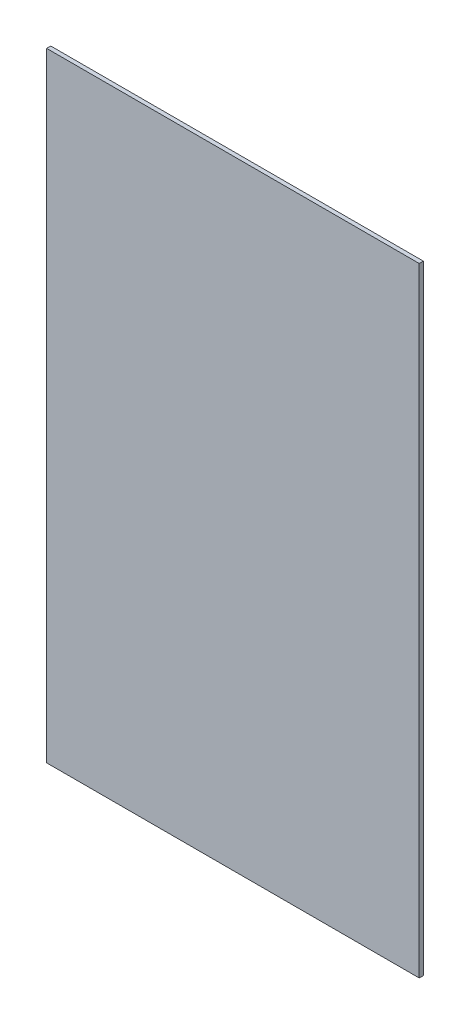
ISO-10303-21;
HEADER;
FILE_DESCRIPTION(('STEP AP214'),'2;1');
FILE_NAME('part.step','',(''),(''),'','','');
FILE_SCHEMA(('AUTOMOTIVE_DESIGN { 1 0 10303 214 1 1 1 1 }'));
ENDSEC;
DATA;
#1=APPLICATION_CONTEXT('core data for automotive mechanical design processes');
#2=APPLICATION_PROTOCOL_DEFINITION('international standard','automotive_design',2000,#1);
#3=PRODUCT_CONTEXT('',#1,'mechanical');
#4=PRODUCT('Part','Part','',(#3));
#5=PRODUCT_RELATED_PRODUCT_CATEGORY('part','',(#4));
#6=PRODUCT_DEFINITION_FORMATION('','',#4);
#7=PRODUCT_DEFINITION_CONTEXT('part definition',#1,'design');
#8=PRODUCT_DEFINITION('design','',#6,#7);
#9=PRODUCT_DEFINITION_SHAPE('','',#8);
#10=(LENGTH_UNIT() NAMED_UNIT(*) SI_UNIT(.MILLI.,.METRE.));
#11=(NAMED_UNIT(*) PLANE_ANGLE_UNIT() SI_UNIT($,.RADIAN.));
#12=(NAMED_UNIT(*) SI_UNIT($,.STERADIAN.) SOLID_ANGLE_UNIT());
#13=UNCERTAINTY_MEASURE_WITH_UNIT(LENGTH_MEASURE(1.E-05),#10,'distance_accuracy_value','');
#14=(GEOMETRIC_REPRESENTATION_CONTEXT(3) GLOBAL_UNCERTAINTY_ASSIGNED_CONTEXT((#13)) GLOBAL_UNIT_ASSIGNED_CONTEXT((#10,
#11,#12)) REPRESENTATION_CONTEXT('',''));
#15=CARTESIAN_POINT('',(0.,0.,0.));
#16=DIRECTION('',(0.,0.,1.));
#17=DIRECTION('',(1.,0.,0.));
#18=AXIS2_PLACEMENT_3D('',#15,#16,#17);
#19=CARTESIAN_POINT('',(227.,-377.,5.));
#20=DIRECTION('',(-1.,0.,0.));
#21=DIRECTION('',(0.,0.,1.));
#22=AXIS2_PLACEMENT_3D('',#19,#20,#21);
#23=PLANE('',#22);
#24=DIRECTION('',(0.,1.,0.));
#25=VECTOR('',#24,1.);
#26=CARTESIAN_POINT('',(227.,-377.,0.));
#27=LINE('',#26,#25);
#28=CARTESIAN_POINT('',(227.,-377.,0.));
#29=VERTEX_POINT('',#28);
#30=CARTESIAN_POINT('',(227.,377.,0.));
#31=VERTEX_POINT('',#30);
#32=EDGE_CURVE('E107',#29,#31,#27,.T.);
#33=ORIENTED_EDGE('',*,*,#32,.T.);
#34=DIRECTION('',(0.,0.,-1.));
#35=VECTOR('',#34,1.);
#36=CARTESIAN_POINT('',(227.,377.,5.));
#37=LINE('',#36,#35);
#38=CARTESIAN_POINT('',(227.,377.,5.));
#39=VERTEX_POINT('',#38);
#40=EDGE_CURVE('E11',#39,#31,#37,.T.);
#41=ORIENTED_EDGE('',*,*,#40,.F.);
#42=DIRECTION('',(0.,1.,0.));
#43=VECTOR('',#42,1.);
#44=CARTESIAN_POINT('',(227.,-377.,5.));
#45=LINE('',#44,#43);
#46=CARTESIAN_POINT('',(227.,-377.,5.));
#47=VERTEX_POINT('',#46);
#48=EDGE_CURVE('E91',#47,#39,#45,.T.);
#49=ORIENTED_EDGE('',*,*,#48,.F.);
#50=DIRECTION('',(0.,0.,-1.));
#51=VECTOR('',#50,1.);
#52=CARTESIAN_POINT('',(227.,-377.,5.));
#53=LINE('',#52,#51);
#54=EDGE_CURVE('E103',#47,#29,#53,.T.);
#55=ORIENTED_EDGE('',*,*,#54,.T.);
#56=EDGE_LOOP('',(#33,#41,#49,#55));
#57=FACE_BOUND('',#56,.T.);
#58=ADVANCED_FACE('F39',(#57),#23,.F.);
#59=CARTESIAN_POINT('',(-227.,377.,5.));
#60=DIRECTION('',(0.,-1.,0.));
#61=DIRECTION('',(0.,0.,-1.));
#62=AXIS2_PLACEMENT_3D('',#59,#60,#61);
#63=PLANE('',#62);
#64=DIRECTION('',(-1.,0.,0.));
#65=VECTOR('',#64,1.);
#66=CARTESIAN_POINT('',(-227.,377.,0.));
#67=LINE('',#66,#65);
#68=CARTESIAN_POINT('',(-227.,377.,0.));
#69=VERTEX_POINT('',#68);
#70=EDGE_CURVE('E96',#31,#69,#67,.T.);
#71=ORIENTED_EDGE('',*,*,#70,.T.);
#72=DIRECTION('',(0.,0.,-1.));
#73=VECTOR('',#72,1.);
#74=CARTESIAN_POINT('',(-227.,377.,5.));
#75=LINE('',#74,#73);
#76=CARTESIAN_POINT('',(-227.,377.,5.));
#77=VERTEX_POINT('',#76);
#78=EDGE_CURVE('E48',#77,#69,#75,.T.);
#79=ORIENTED_EDGE('',*,*,#78,.F.);
#80=DIRECTION('',(-1.,0.,0.));
#81=VECTOR('',#80,1.);
#82=CARTESIAN_POINT('',(-227.,377.,5.));
#83=LINE('',#82,#81);
#84=EDGE_CURVE('E86',#39,#77,#83,.T.);
#85=ORIENTED_EDGE('',*,*,#84,.F.);
#86=ORIENTED_EDGE('',*,*,#40,.T.);
#87=EDGE_LOOP('',(#71,#79,#85,#86));
#88=FACE_BOUND('',#87,.T.);
#89=ADVANCED_FACE('F95',(#88),#63,.F.);
#90=CARTESIAN_POINT('',(-227.,-377.,5.));
#91=DIRECTION('',(1.,0.,0.));
#92=DIRECTION('',(0.,0.,-1.));
#93=AXIS2_PLACEMENT_3D('',#90,#91,#92);
#94=PLANE('',#93);
#95=DIRECTION('',(0.,-1.,0.));
#96=VECTOR('',#95,1.);
#97=CARTESIAN_POINT('',(-227.,-377.,0.));
#98=LINE('',#97,#96);
#99=CARTESIAN_POINT('',(-227.,-377.,0.));
#100=VERTEX_POINT('',#99);
#101=EDGE_CURVE('E73',#69,#100,#98,.T.);
#102=ORIENTED_EDGE('',*,*,#101,.T.);
#103=DIRECTION('',(0.,0.,-1.));
#104=VECTOR('',#103,1.);
#105=CARTESIAN_POINT('',(-227.,-377.,5.));
#106=LINE('',#105,#104);
#107=CARTESIAN_POINT('',(-227.,-377.,5.));
#108=VERTEX_POINT('',#107);
#109=EDGE_CURVE('E98',#108,#100,#106,.T.);
#110=ORIENTED_EDGE('',*,*,#109,.F.);
#111=DIRECTION('',(0.,-1.,0.));
#112=VECTOR('',#111,1.);
#113=CARTESIAN_POINT('',(-227.,-377.,5.));
#114=LINE('',#113,#112);
#115=EDGE_CURVE('E89',#77,#108,#114,.T.);
#116=ORIENTED_EDGE('',*,*,#115,.F.);
#117=ORIENTED_EDGE('',*,*,#78,.T.);
#118=EDGE_LOOP('',(#102,#110,#116,#117));
#119=FACE_BOUND('',#118,.T.);
#120=ADVANCED_FACE('F99',(#119),#94,.F.);
#121=CARTESIAN_POINT('',(-227.,-377.,5.));
#122=DIRECTION('',(0.,1.,0.));
#123=DIRECTION('',(0.,0.,1.));
#124=AXIS2_PLACEMENT_3D('',#121,#122,#123);
#125=PLANE('',#124);
#126=DIRECTION('',(1.,0.,0.));
#127=VECTOR('',#126,1.);
#128=CARTESIAN_POINT('',(-227.,-377.,0.));
#129=LINE('',#128,#127);
#130=EDGE_CURVE('E79',#100,#29,#129,.T.);
#131=ORIENTED_EDGE('',*,*,#130,.T.);
#132=ORIENTED_EDGE('',*,*,#54,.F.);
#133=DIRECTION('',(1.,0.,0.));
#134=VECTOR('',#133,1.);
#135=CARTESIAN_POINT('',(-227.,-377.,5.));
#136=LINE('',#135,#134);
#137=EDGE_CURVE('E56',#108,#47,#136,.T.);
#138=ORIENTED_EDGE('',*,*,#137,.F.);
#139=ORIENTED_EDGE('',*,*,#109,.T.);
#140=EDGE_LOOP('',(#131,#132,#138,#139));
#141=FACE_BOUND('',#140,.T.);
#142=ADVANCED_FACE('F120',(#141),#125,.F.);
#143=CARTESIAN_POINT('',(0.,0.,5.));
#144=DIRECTION('',(0.,0.,-1.));
#145=DIRECTION('',(-1.,0.,0.));
#146=AXIS2_PLACEMENT_3D('',#143,#144,#145);
#147=PLANE('',#146);
#148=ORIENTED_EDGE('',*,*,#48,.T.);
#149=ORIENTED_EDGE('',*,*,#84,.T.);
#150=ORIENTED_EDGE('',*,*,#115,.T.);
#151=ORIENTED_EDGE('',*,*,#137,.T.);
#152=EDGE_LOOP('',(#148,#149,#150,#151));
#153=FACE_BOUND('',#152,.T.);
#154=ADVANCED_FACE('F87',(#153),#147,.F.);
#155=CARTESIAN_POINT('',(0.,0.,0.));
#156=DIRECTION('',(0.,0.,-1.));
#157=DIRECTION('',(-1.,0.,0.));
#158=AXIS2_PLACEMENT_3D('',#155,#156,#157);
#159=PLANE('',#158);
#160=ORIENTED_EDGE('',*,*,#32,.F.);
#161=ORIENTED_EDGE('',*,*,#130,.F.);
#162=ORIENTED_EDGE('',*,*,#101,.F.);
#163=ORIENTED_EDGE('',*,*,#70,.F.);
#164=EDGE_LOOP('',(#160,#161,#162,#163));
#165=FACE_BOUND('',#164,.T.);
#166=ADVANCED_FACE('F123',(#165),#159,.T.);
#167=CLOSED_SHELL('',(#58,#89,#120,#142,#154,#166));
#168=MANIFOLD_SOLID_BREP('B2',#167);
#169=ADVANCED_BREP_SHAPE_REPRESENTATION('',(#18,#168),#14);
#170=SHAPE_DEFINITION_REPRESENTATION(#9,#169);
ENDSEC;
END-ISO-10303-21;
